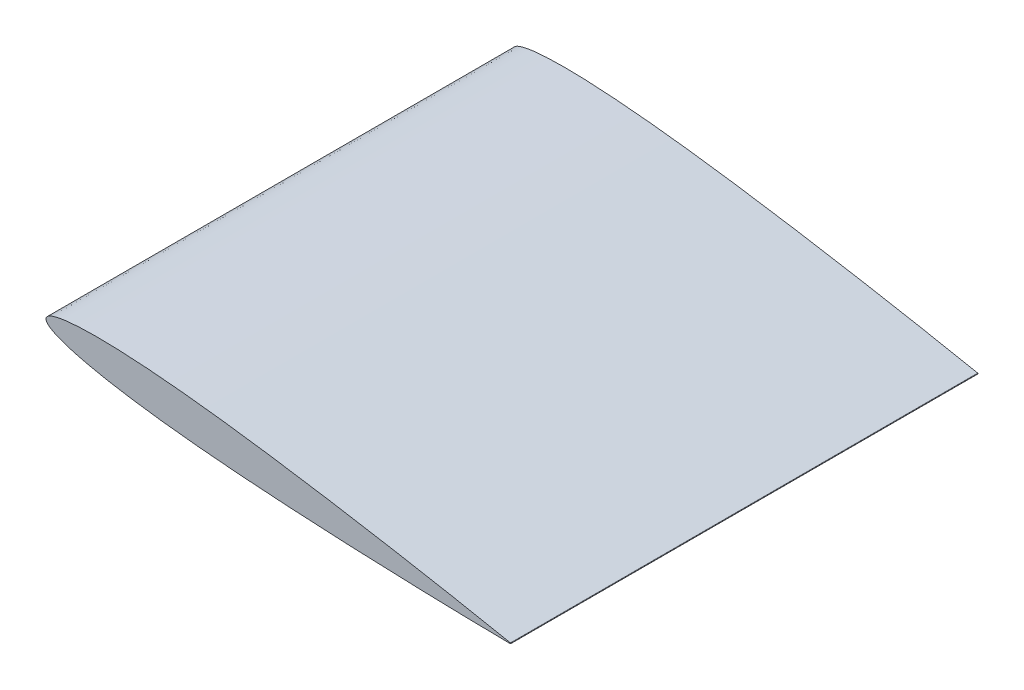
ISO-10303-21;
HEADER;
FILE_DESCRIPTION(('STEP AP214'),'2;1');
FILE_NAME('part.step','',(''),(''),'','','');
FILE_SCHEMA(('AUTOMOTIVE_DESIGN { 1 0 10303 214 1 1 1 1 }'));
ENDSEC;
DATA;
#1=APPLICATION_CONTEXT('core data for automotive mechanical design processes');
#2=APPLICATION_PROTOCOL_DEFINITION('international standard','automotive_design',2000,#1);
#3=PRODUCT_CONTEXT('',#1,'mechanical');
#4=PRODUCT('Part','Part','',(#3));
#5=PRODUCT_RELATED_PRODUCT_CATEGORY('part','',(#4));
#6=PRODUCT_DEFINITION_FORMATION('','',#4);
#7=PRODUCT_DEFINITION_CONTEXT('part definition',#1,'design');
#8=PRODUCT_DEFINITION('design','',#6,#7);
#9=PRODUCT_DEFINITION_SHAPE('','',#8);
#10=(LENGTH_UNIT() NAMED_UNIT(*) SI_UNIT(.MILLI.,.METRE.));
#11=(NAMED_UNIT(*) PLANE_ANGLE_UNIT() SI_UNIT($,.RADIAN.));
#12=(NAMED_UNIT(*) SI_UNIT($,.STERADIAN.) SOLID_ANGLE_UNIT());
#13=UNCERTAINTY_MEASURE_WITH_UNIT(LENGTH_MEASURE(1.E-05),#10,'distance_accuracy_value','');
#14=(GEOMETRIC_REPRESENTATION_CONTEXT(3) GLOBAL_UNCERTAINTY_ASSIGNED_CONTEXT((#13)) GLOBAL_UNIT_ASSIGNED_CONTEXT((#10,
#11,#12)) REPRESENTATION_CONTEXT('',''));
#15=CARTESIAN_POINT('',(0.,0.,0.));
#16=DIRECTION('',(0.,0.,1.));
#17=DIRECTION('',(1.,0.,0.));
#18=AXIS2_PLACEMENT_3D('',#15,#16,#17);
#19=CARTESIAN_POINT('',(141.964209086407,-14.7601864212014,-190.5));
#20=CARTESIAN_POINT('',(141.717840284449,-14.7107458264424,-190.5));
#21=CARTESIAN_POINT('',(141.333239439706,-14.633364335522,-190.5));
#22=CARTESIAN_POINT('',(140.779909053131,-14.5223195870705,-190.5));
#23=CARTESIAN_POINT('',(140.273837259706,-14.4210699585725,-190.5));
#24=CARTESIAN_POINT('',(139.676970785638,-14.3017762504471,-190.5));
#25=CARTESIAN_POINT('',(138.989766271427,-14.1647626829065,-190.5));
#26=CARTESIAN_POINT('',(138.2130443455,-14.0099092094399,-190.5));
#27=CARTESIAN_POINT('',(137.347333734475,-13.8382086760727,-190.5));
#28=CARTESIAN_POINT('',(136.393642519682,-13.6495424340441,-190.5));
#29=CARTESIAN_POINT('',(135.35298579186,-13.4437780665821,-190.5));
#30=CARTESIAN_POINT('',(134.226178354788,-13.2224250650618,-190.5));
#31=CARTESIAN_POINT('',(133.014433444252,-12.9847030663705,-190.5));
#32=CARTESIAN_POINT('',(131.718864681405,-12.7315865939058,-190.5));
#33=CARTESIAN_POINT('',(130.340741085886,-12.4633478320614,-190.5));
#34=CARTESIAN_POINT('',(128.881416542602,-12.1807578722215,-190.5));
#35=CARTESIAN_POINT('',(127.342373318464,-11.8836210068006,-190.5));
#36=CARTESIAN_POINT('',(125.724990220786,-11.5729400609925,-190.5));
#37=CARTESIAN_POINT('',(124.030919727435,-11.2493085937546,-190.5));
#38=CARTESIAN_POINT('',(122.261894133946,-10.9125597401053,-190.5));
#39=CARTESIAN_POINT('',(120.419535289086,-10.5637795998122,-190.5));
#40=CARTESIAN_POINT('',(118.505504200986,-10.2035186988897,-190.5));
#41=CARTESIAN_POINT('',(116.521915523221,-9.831646534504,-190.5));
#42=CARTESIAN_POINT('',(114.470588394895,-9.44958081466691,-190.5));
#43=CARTESIAN_POINT('',(112.353587299462,-9.05746095741273,-190.5));
#44=CARTESIAN_POINT('',(110.172988249332,-8.65567272921419,-190.5));
#45=CARTESIAN_POINT('',(107.930819738033,-8.24521313839941,-190.5));
#46=CARTESIAN_POINT('',(105.62938486056,-7.82631254503986,-190.5));
#47=CARTESIAN_POINT('',(103.270911797755,-7.39960432832829,-190.5));
#48=CARTESIAN_POINT('',(100.857548375852,-6.96614847493881,-190.5));
#49=CARTESIAN_POINT('',(98.3919145666271,-6.52583415106059,-190.5));
#50=CARTESIAN_POINT('',(95.8762883077157,-6.07971045530366,-190.5));
#51=CARTESIAN_POINT('',(93.313143727192,-5.62848399446458,-190.5));
#52=CARTESIAN_POINT('',(90.7050591751246,-5.17228513242238,-190.5));
#53=CARTESIAN_POINT('',(88.0544295805164,-4.71261295178478,-190.5));
#54=CARTESIAN_POINT('',(85.3639942224461,-4.24938799746568,-190.5));
#55=CARTESIAN_POINT('',(82.6363644744811,-3.78325236129781,-190.5));
#56=CARTESIAN_POINT('',(79.8740844336686,-3.31563379692277,-190.5));
#57=CARTESIAN_POINT('',(77.0801014305033,-2.8463639379538,-190.5));
#58=CARTESIAN_POINT('',(74.2569380944492,-2.37659481533454,-190.5));
#59=CARTESIAN_POINT('',(71.4074935528955,-1.90683913136029,-190.5));
#60=CARTESIAN_POINT('',(67.5639508123071,-1.27985312755456,-190.5));
#61=CARTESIAN_POINT('',(63.694254126966,-0.658025629812975,-190.5));
#62=CARTESIAN_POINT('',(59.8018034914009,-0.0440702285535669,-190.5));
#63=CARTESIAN_POINT('',(56.8627478051569,0.414441884042062,-190.5));
#64=CARTESIAN_POINT('',(53.9142006647246,0.867926761926778,-190.5));
#65=CARTESIAN_POINT('',(50.9592455328825,1.31624774120673,-190.5));
#66=CARTESIAN_POINT('',(48.0007512419188,1.75875657046678,-190.5));
#67=CARTESIAN_POINT('',(45.0414815701327,2.19408382921712,-190.5));
#68=CARTESIAN_POINT('',(42.0843661247459,2.62197141162646,-190.5));
#69=CARTESIAN_POINT('',(39.1322804032985,3.0418240125027,-190.5));
#70=CARTESIAN_POINT('',(36.1881091339395,3.45218620090561,-190.5));
#71=CARTESIAN_POINT('',(33.2547466279636,3.8530284652526,-190.5));
#72=CARTESIAN_POINT('',(30.3350287639927,4.24301379166332,-190.5));
#73=CARTESIAN_POINT('',(27.43185327184,4.62218230923401,-190.5));
#74=CARTESIAN_POINT('',(24.5479479306955,4.98881887043301,-190.5));
#75=CARTESIAN_POINT('',(21.6863201970008,5.34336294162963,-190.5));
#76=CARTESIAN_POINT('',(18.8494901051312,5.6839284431463,-190.5));
#77=CARTESIAN_POINT('',(16.040505055733,6.01136520283245,-190.5));
#78=CARTESIAN_POINT('',(13.2617917157488,6.3234619685337,-190.5));
#79=CARTESIAN_POINT('',(9.62648824414619,6.71723969653983,-190.5));
#80=CARTESIAN_POINT('',(6.03986310235682,7.08246264422255,-190.5));
#81=CARTESIAN_POINT('',(2.50543487516625,7.41647333272402,-190.5));
#82=CARTESIAN_POINT('',(-0.0809330737924468,7.64807927156673,-190.5));
#83=CARTESIAN_POINT('',(-2.62111691749232,7.8620567520378,-190.5));
#84=CARTESIAN_POINT('',(-5.11256937168542,8.05850336225749,-190.5));
#85=CARTESIAN_POINT('',(-7.55296433729756,8.23621473702159,-190.5));
#86=CARTESIAN_POINT('',(-9.93970419923642,8.39601394360452,-190.5));
#87=CARTESIAN_POINT('',(-12.2705857667435,8.53658055915639,-190.5));
#88=CARTESIAN_POINT('',(-14.5432784145848,8.65860387001757,-190.5));
#89=CARTESIAN_POINT('',(-16.7555217865439,8.76152106152905,-190.5));
#90=CARTESIAN_POINT('',(-18.9051493227722,8.84549821030985,-190.5));
#91=CARTESIAN_POINT('',(-21.6397854259246,8.93022974692458,-190.5));
#92=CARTESIAN_POINT('',(-24.2844911163367,8.97951286292535,-190.5));
#93=CARTESIAN_POINT('',(-26.8361708409259,8.98964539658046,-190.5));
#94=CARTESIAN_POINT('',(-28.6421412812899,8.97766380886542,-190.5));
#95=CARTESIAN_POINT('',(-30.3737599019717,8.94761009296009,-190.5));
#96=CARTESIAN_POINT('',(-32.0293172119453,8.89825515401224,-190.5));
#97=CARTESIAN_POINT('',(-33.6071151132633,8.83084771191534,-190.5));
#98=CARTESIAN_POINT('',(-35.1055819456191,8.74505150772407,-190.5));
#99=CARTESIAN_POINT('',(-36.523309442501,8.64124251580328,-190.5));
#100=CARTESIAN_POINT('',(-37.8588299623645,8.51973020524842,-190.5));
#101=CARTESIAN_POINT('',(-39.110813754892,8.3805001272392,-190.5));
#102=CARTESIAN_POINT('',(-40.2780168049369,8.22430156483013,-190.5));
#103=CARTESIAN_POINT('',(-41.3594611595277,8.05141433367991,-190.5));
#104=CARTESIAN_POINT('',(-42.3539552717994,7.86143258715219,-190.5));
#105=CARTESIAN_POINT('',(-43.2606853965123,7.65533527454726,-190.5));
#106=CARTESIAN_POINT('',(-44.0788488100922,7.4335158946402,-190.5));
#107=CARTESIAN_POINT('',(-44.8075774979609,7.19531712878671,-190.5));
#108=CARTESIAN_POINT('',(-45.4467096952308,6.94203427367345,-190.5));
#109=CARTESIAN_POINT('',(-45.9956686360767,6.67286365325742,-190.5));
#110=CARTESIAN_POINT('',(-46.4544855238625,6.38815823565103,-190.5));
#111=CARTESIAN_POINT('',(-46.8233372619453,6.08719342137089,-190.5));
#112=CARTESIAN_POINT('',(-47.1011181850916,5.76804502068038,-190.5));
#113=CARTESIAN_POINT('',(-47.286243052105,5.4294986347848,-190.5));
#114=CARTESIAN_POINT('',(-47.3737328799705,5.0734086773957,-190.5));
#115=CARTESIAN_POINT('',(-47.3625507312495,4.70689880401811,-190.5));
#116=CARTESIAN_POINT('',(-47.2522227258773,4.33715212990154,-190.5));
#117=CARTESIAN_POINT('',(-47.047230684881,3.96702214455114,-190.5));
#118=CARTESIAN_POINT('',(-46.7493785392983,3.59565235109295,-190.5));
#119=CARTESIAN_POINT('',(-46.360149479173,3.22139194698124,-190.5));
#120=CARTESIAN_POINT('',(-45.8795218530613,2.84349536503328,-190.5));
#121=CARTESIAN_POINT('',(-45.3073914200557,2.46230127023313,-190.5));
#122=CARTESIAN_POINT('',(-44.6444900909327,2.07714418484635,-190.5));
#123=CARTESIAN_POINT('',(-43.8907055088593,1.68932462312776,-190.5));
#124=CARTESIAN_POINT('',(-43.0470238389389,1.29838107072502,-190.5));
#125=CARTESIAN_POINT('',(-42.1141479071409,0.904866014814099,-190.5));
#126=CARTESIAN_POINT('',(-41.0926690326851,0.509906781712963,-190.5));
#127=CARTESIAN_POINT('',(-39.9838372507519,0.113355359691179,-190.5));
#128=CARTESIAN_POINT('',(-38.7885504970318,-0.284310338798126,-190.5));
#129=CARTESIAN_POINT('',(-37.507868841286,-0.68209771570871,-190.5));
#130=CARTESIAN_POINT('',(-36.143095720969,-1.07974315108878,-190.5));
#131=CARTESIAN_POINT('',(-34.6956017652563,-1.47663744998882,-190.5));
#132=CARTESIAN_POINT('',(-33.1666856467386,-1.87211878101538,-190.5));
#133=CARTESIAN_POINT('',(-31.5579545946718,-2.26618770737395,-190.5));
#134=CARTESIAN_POINT('',(-29.8708084264333,-2.65726836443823,-190.5));
#135=CARTESIAN_POINT('',(-28.1071756518834,-3.04620566844237,-190.5));
#136=CARTESIAN_POINT('',(-25.6096629447972,-3.56927580050979,-190.5));
#137=CARTESIAN_POINT('',(-23.0129986506314,-4.07348960221069,-190.5));
#138=CARTESIAN_POINT('',(-20.3209833273684,-4.56182099509724,-190.5));
#139=CARTESIAN_POINT('',(-18.2012303707241,-4.92869714426216,-190.5));
#140=CARTESIAN_POINT('',(-16.0162866416908,-5.29012982961838,-190.5));
#141=CARTESIAN_POINT('',(-13.7682362223615,-5.64550410006945,-190.5));
#142=CARTESIAN_POINT('',(-11.4594071686197,-5.99489822673673,-190.5));
#143=CARTESIAN_POINT('',(-9.09193472425772,-6.3371513204836,-190.5));
#144=CARTESIAN_POINT('',(-6.66824928516285,-6.67309449011916,-190.5));
#145=CARTESIAN_POINT('',(-4.19071925254277,-7.00138024923366,-190.5));
#146=CARTESIAN_POINT('',(-1.66187097815437,-7.32270053658819,-190.5));
#147=CARTESIAN_POINT('',(0.915824823846765,-7.63642785553522,-190.5));
#148=CARTESIAN_POINT('',(4.44205882676927,-8.04803420853228,-190.5));
#149=CARTESIAN_POINT('',(8.02585784043452,-8.44001933437529,-190.5));
#150=CARTESIAN_POINT('',(11.6632258130736,-8.81424715447755,-190.5));
#151=CARTESIAN_POINT('',(14.4458367943845,-9.08943498788558,-190.5));
#152=CARTESIAN_POINT('',(17.2612558932912,-9.35594415629746,-190.5));
#153=CARTESIAN_POINT('',(20.1066480960812,-9.61543027011111,-190.5));
#154=CARTESIAN_POINT('',(22.97921072668,-9.86642572417025,-190.5));
#155=CARTESIAN_POINT('',(25.8760853834131,-10.1102486268426,-190.5));
#156=CARTESIAN_POINT('',(28.7944227395627,-10.3458410262415,-190.5));
#157=CARTESIAN_POINT('',(31.7311969342069,-10.5743104764494,-190.5));
#158=CARTESIAN_POINT('',(34.6835825358579,-10.7950124735313,-190.5));
#159=CARTESIAN_POINT('',(37.6485269507866,-11.0086621994217,-190.5));
#160=CARTESIAN_POINT('',(40.6231935445033,-11.2146839688106,-190.5));
#161=CARTESIAN_POINT('',(43.6044572170185,-11.4138985653304,-190.5));
#162=CARTESIAN_POINT('',(46.5893815531248,-11.606287547042,-190.5));
#163=CARTESIAN_POINT('',(49.5750476535814,-11.7914914082915,-190.5));
#164=CARTESIAN_POINT('',(52.5584666657427,-11.9702720826892,-190.5));
#165=CARTESIAN_POINT('',(55.536697633553,-12.1426642988594,-190.5));
#166=CARTESIAN_POINT('',(58.5066965619151,-12.3081576515026,-190.5));
#167=CARTESIAN_POINT('',(62.4415290571206,-12.5207756651342,-190.5));
#168=CARTESIAN_POINT('',(66.3557537703492,-12.7209425151332,-190.5));
#169=CARTESIAN_POINT('',(70.2454789040576,-12.9106017672013,-190.5));
#170=CARTESIAN_POINT('',(73.1301917652832,-13.046382127695,-190.5));
#171=CARTESIAN_POINT('',(75.9892059232431,-13.1766598893874,-190.5));
#172=CARTESIAN_POINT('',(78.8195791076791,-13.3013308937907,-190.5));
#173=CARTESIAN_POINT('',(81.6186037026539,-13.4209948497043,-190.5));
#174=CARTESIAN_POINT('',(84.3834325554774,-13.5348714841995,-190.5));
#175=CARTESIAN_POINT('',(87.1112794648869,-13.6438256630292,-190.5));
#176=CARTESIAN_POINT('',(89.7994565412517,-13.7479398674939,-190.5));
#177=CARTESIAN_POINT('',(92.4453015229773,-13.846564231313,-190.5));
#178=CARTESIAN_POINT('',(95.0461591878292,-13.9406645331772,-190.5));
#179=CARTESIAN_POINT('',(97.5994808278507,-14.0298297115705,-190.5));
#180=CARTESIAN_POINT('',(100.102699296137,-14.1142340067193,-190.5));
#181=CARTESIAN_POINT('',(102.553367771182,-14.1944275752338,-190.5));
#182=CARTESIAN_POINT('',(104.948947221283,-14.269754784418,-190.5));
#183=CARTESIAN_POINT('',(107.287115792183,-14.3408036156533,-190.5));
#184=CARTESIAN_POINT('',(109.565562154583,-14.4077280687185,-190.5));
#185=CARTESIAN_POINT('',(111.781985897597,-14.4702723662204,-190.5));
#186=CARTESIAN_POINT('',(113.934195022038,-14.5289878258154,-190.5));
#187=CARTESIAN_POINT('',(116.020078730416,-14.5838180802628,-190.5));
#188=CARTESIAN_POINT('',(118.037588955649,-14.634468255789,-190.5));
#189=CARTESIAN_POINT('',(119.984650561994,-14.6819448188548,-190.5));
#190=CARTESIAN_POINT('',(121.859222798282,-14.7256784493466,-190.5));
#191=CARTESIAN_POINT('',(123.659566303426,-14.7658605889386,-190.5));
#192=CARTESIAN_POINT('',(125.383868144596,-14.8032146190575,-190.5));
#193=CARTESIAN_POINT('',(127.030469089938,-14.8372155240929,-190.5));
#194=CARTESIAN_POINT('',(128.597629132016,-14.8680986112157,-190.5));
#195=CARTESIAN_POINT('',(130.083790412472,-14.8965565891041,-190.5));
#196=CARTESIAN_POINT('',(131.487544237557,-14.922088460178,-190.5));
#197=CARTESIAN_POINT('',(132.807405524729,-14.9451655163918,-190.5));
#198=CARTESIAN_POINT('',(134.042076393429,-14.965788873439,-190.5));
#199=CARTESIAN_POINT('',(135.190264233645,-14.9846789529204,-190.5));
#200=CARTESIAN_POINT('',(136.250945567875,-15.0008191912805,-190.5));
#201=CARTESIAN_POINT('',(137.223008271524,-15.0155155932258,-190.5));
#202=CARTESIAN_POINT('',(138.105487302522,-15.0284266368443,-190.5));
#203=CARTESIAN_POINT('',(138.897421597825,-15.0392257286304,-190.5));
#204=CARTESIAN_POINT('',(139.598086713581,-15.0487733778364,-190.5));
#205=CARTESIAN_POINT('',(140.206705196874,-15.0567807780469,-190.5));
#206=CARTESIAN_POINT('',(140.91112844747,-15.0659111049002,-190.5));
#207=CARTESIAN_POINT('',(141.475451169777,-15.0726471842087,-190.5));
#208=CARTESIAN_POINT('',(141.867730050143,-15.0774403552898,-190.5));
#209=CARTESIAN_POINT('',(141.930624364997,-15.0782188168808,-190.5));
#210=B_SPLINE_CURVE_WITH_KNOTS('',3,(#19,#20,#21,#22,#23,#24,#25,#26,#27,#28,#29,#30,#31,#32,
#33,#34,#35,#36,#37,#38,#39,#40,#41,#42,#43,#44,#45,#46,#47,#48,#49,#50,#51,#52,#53,#54,#55,#56,
#57,#58,#59,#60,#61,#62,#63,#64,#65,#66,#67,#68,#69,#70,#71,#72,#73,#74,#75,#76,#77,#78,#79,#80,
#81,#82,#83,#84,#85,#86,#87,#88,#89,#90,#91,#92,#93,#94,#95,#96,#97,#98,#99,#100,#101,#102,#103,
#104,#105,#106,#107,#108,#109,#110,#111,#112,#113,#114,#115,#116,#117,#118,#119,#120,#121,#122,
#123,#124,#125,#126,#127,#128,#129,#130,#131,#132,#133,#134,#135,#136,#137,#138,#139,#140,#141,
#142,#143,#144,#145,#146,#147,#148,#149,#150,#151,#152,#153,#154,#155,#156,#157,#158,#159,#160,
#161,#162,#163,#164,#165,#166,#167,#168,#169,#170,#171,#172,#173,#174,#175,#176,#177,#178,#179,
#180,#181,#182,#183,#184,#185,#186,#187,#188,#189,#190,#191,#192,#193,#194,#195,#196,#197,#198,
#199,#200,#201,#202,#203,#204,#205,#206,#207,#208,#209),.UNSPECIFIED.,.F.,.F.,(4,1,1,1,1,1,1,1,
1,1,1,1,1,1,1,1,1,1,1,1,1,1,1,1,1,1,1,1,1,1,1,1,1,1,1,1,1,1,1,1,1,1,1,1,1,1,1,1,1,1,1,1,1,1,1,1,
1,1,1,1,1,1,1,1,1,1,1,1,1,1,1,1,1,1,1,1,1,1,1,1,1,1,1,1,1,1,1,1,1,1,1,1,1,1,1,1,1,1,1,1,1,1,1,1,
1,1,1,1,1,1,1,1,1,1,1,1,1,1,1,1,1,1,1,1,1,1,1,1,1,1,1,1,1,1,1,1,1,1,1,1,1,1,1,1,1,1,1,1,1,1,1,1,
1,1,1,1,1,1,1,1,1,1,1,1,1,1,1,1,1,1,1,1,1,1,1,1,1,1,1,1,1,1,1,1,1,1,1,1,4),(0.,
0.00196048808038713,0.00306078288954723,0.00440315115940912,0.00598710015129242,
0.00780962678363534,0.00987023823900945,0.0121663346757214,0.0146954518877861,
0.0174551251234933,0.02044271277755,0.0236548086080142,0.0270893538626305,0.0307418252005211,
0.0346086867033355,0.0386864881218547,0.0429711593175618,0.0474581806910442,0.0521426222949407,
0.0570209113106773,0.0620875440252226,0.0673380838166943,0.0727664556702497,0.0783671978029203,
0.0841358352788509,0.0900658434760326,0.0961512680582257,0.102386611537683,0.108765354390163,
0.115281579792531,0.121927783097088,0.128698472150078,0.135586708286801,0.142584959552117,
0.149687310329046,0.156886297525978,0.164174397596375,0.171545202082814,0.178990235007278,
0.186503524082293,0.19407660018027,0.209373856557355,0.217082104500233,0.224820878258927,
0.232581678728304,0.240357097895689,0.248139212500892,0.255920557432258,0.263693736348385,
0.271450841908107,0.279184433986156,0.286886142530036,0.294549552175486,0.302166304681413,
0.309729003720638,0.317230802900191,0.324663342863254,0.33202078832295,0.339294805126573,
0.346479079665125,0.360549206686105,0.367421988824451,0.374177392410363,0.380808670431015,
0.387310567301367,0.39367589404474,0.399898904621057,0.405973448559045,0.411894304865592,
0.417655822568995,0.423251855178719,0.428678293697983,0.439001415070994,0.443888497126718,
0.448586274186794,0.453091621508016,0.457400294036188,0.461508300583175,0.465412430347771,
0.469110006265822,0.472598492016245,0.475874566730092,0.478937452099033,0.481785324488124,
0.484418023324207,0.486835407607488,0.489038388494032,0.491029428368055,0.492813910030444,
0.494397940793629,0.49579342619979,0.497018051790781,0.498098706349558,0.499074547748848,0.5,
0.500925452251153,0.501901293650443,0.50298194820922,0.504206573800211,0.505602059206371,
0.507186089969557,0.508970571631945,0.510961611505969,0.513164592392513,0.515581976675793,
0.518214675511877,0.521062547900968,0.524125433269908,0.527401507983756,0.530889993734179,
0.534587569652229,0.538491699416826,0.542599705963813,0.546908378491985,0.551413725813207,
0.556111502873283,0.560998584929006,0.571321706302018,0.576748144821282,0.582344177431006,
0.588105695134409,0.594026551440956,0.600101095378944,0.606324105955261,0.612689432698634,
0.619191329568986,0.625822607589638,0.63257801117555,0.639450793313896,0.653520920334876,
0.660705194873427,0.66797921167705,0.675336657136746,0.68276919709981,0.690270996279362,
0.697833695318588,0.705450447824515,0.713113857469964,0.720815566013845,0.728549158091893,
0.736306263651616,0.744079442567742,0.751860787499109,0.759642902104311,0.767418321271696,
0.775179121741073,0.782917895499768,0.790626143442646,0.80592339981973,0.813496475917707,
0.821009764992723,0.828454797917186,0.835825602403626,0.843113702474022,0.850312689670955,
0.857415040447883,0.864413291713199,0.871301527849922,0.878072216902913,0.884718420207469,
0.891234645609837,0.897613388462318,0.903848731941775,0.909934156523968,0.91586416472115,
0.92163280219708,0.927233544329751,0.932661916183306,0.937912455974778,0.942979088689323,
0.94785737770506,0.952541819308956,0.957028840682438,0.961313511878146,0.965391313296665,
0.969258174799479,0.97291064613737,0.976345191391986,0.97955728722245,0.982544874876507,
0.985304548112214,0.987833665324279,0.990129761760991,0.992190373216365,0.994012899848708,
0.995596848840591,0.996939217110453,0.999509261835069,1.),.UNSPECIFIED.);
#211=DIRECTION('',(0.,0.,1.));
#212=VECTOR('',#211,1.);
#213=SURFACE_OF_LINEAR_EXTRUSION('',#210,#212);
#214=CARTESIAN_POINT('',(141.964209086407,-14.7601864212014,0.));
#215=CARTESIAN_POINT('',(141.717840284449,-14.7107458264424,0.));
#216=CARTESIAN_POINT('',(141.333239439706,-14.633364335522,0.));
#217=CARTESIAN_POINT('',(140.779909053131,-14.5223195870705,0.));
#218=CARTESIAN_POINT('',(140.273837259706,-14.4210699585725,0.));
#219=CARTESIAN_POINT('',(139.676970785638,-14.3017762504471,0.));
#220=CARTESIAN_POINT('',(138.989766271427,-14.1647626829065,0.));
#221=CARTESIAN_POINT('',(138.2130443455,-14.0099092094399,0.));
#222=CARTESIAN_POINT('',(137.347333734475,-13.8382086760727,0.));
#223=CARTESIAN_POINT('',(136.393642519682,-13.6495424340441,0.));
#224=CARTESIAN_POINT('',(135.35298579186,-13.4437780665821,0.));
#225=CARTESIAN_POINT('',(134.226178354788,-13.2224250650618,0.));
#226=CARTESIAN_POINT('',(133.014433444252,-12.9847030663705,0.));
#227=CARTESIAN_POINT('',(131.718864681405,-12.7315865939058,0.));
#228=CARTESIAN_POINT('',(130.340741085886,-12.4633478320614,0.));
#229=CARTESIAN_POINT('',(128.881416542602,-12.1807578722215,0.));
#230=CARTESIAN_POINT('',(127.342373318464,-11.8836210068006,0.));
#231=CARTESIAN_POINT('',(125.724990220786,-11.5729400609925,0.));
#232=CARTESIAN_POINT('',(124.030919727435,-11.2493085937546,0.));
#233=CARTESIAN_POINT('',(122.261894133946,-10.9125597401053,0.));
#234=CARTESIAN_POINT('',(120.419535289086,-10.5637795998122,0.));
#235=CARTESIAN_POINT('',(118.505504200986,-10.2035186988897,0.));
#236=CARTESIAN_POINT('',(116.521915523221,-9.831646534504,0.));
#237=CARTESIAN_POINT('',(114.470588394895,-9.44958081466691,0.));
#238=CARTESIAN_POINT('',(112.353587299462,-9.05746095741273,0.));
#239=CARTESIAN_POINT('',(110.172988249332,-8.65567272921419,0.));
#240=CARTESIAN_POINT('',(107.930819738033,-8.24521313839941,0.));
#241=CARTESIAN_POINT('',(105.62938486056,-7.82631254503986,0.));
#242=CARTESIAN_POINT('',(103.270911797755,-7.39960432832829,0.));
#243=CARTESIAN_POINT('',(100.857548375852,-6.96614847493881,0.));
#244=CARTESIAN_POINT('',(98.3919145666271,-6.52583415106059,0.));
#245=CARTESIAN_POINT('',(95.8762883077157,-6.07971045530366,0.));
#246=CARTESIAN_POINT('',(93.313143727192,-5.62848399446458,0.));
#247=CARTESIAN_POINT('',(90.7050591751246,-5.17228513242238,0.));
#248=CARTESIAN_POINT('',(88.0544295805164,-4.71261295178478,0.));
#249=CARTESIAN_POINT('',(85.3639942224461,-4.24938799746568,0.));
#250=CARTESIAN_POINT('',(82.6363644744811,-3.78325236129781,0.));
#251=CARTESIAN_POINT('',(79.8740844336686,-3.31563379692277,0.));
#252=CARTESIAN_POINT('',(77.0801014305033,-2.8463639379538,0.));
#253=CARTESIAN_POINT('',(74.2569380944492,-2.37659481533454,0.));
#254=CARTESIAN_POINT('',(71.4074935528955,-1.90683913136029,0.));
#255=CARTESIAN_POINT('',(67.5639508123071,-1.27985312755456,0.));
#256=CARTESIAN_POINT('',(63.694254126966,-0.658025629812975,0.));
#257=CARTESIAN_POINT('',(59.8018034914009,-0.0440702285535669,0.));
#258=CARTESIAN_POINT('',(56.8627478051569,0.414441884042062,0.));
#259=CARTESIAN_POINT('',(53.9142006647246,0.867926761926778,0.));
#260=CARTESIAN_POINT('',(50.9592455328825,1.31624774120673,0.));
#261=CARTESIAN_POINT('',(48.0007512419188,1.75875657046678,0.));
#262=CARTESIAN_POINT('',(45.0414815701327,2.19408382921712,0.));
#263=CARTESIAN_POINT('',(42.0843661247459,2.62197141162646,0.));
#264=CARTESIAN_POINT('',(39.1322804032985,3.0418240125027,0.));
#265=CARTESIAN_POINT('',(36.1881091339395,3.45218620090561,0.));
#266=CARTESIAN_POINT('',(33.2547466279636,3.8530284652526,0.));
#267=CARTESIAN_POINT('',(30.3350287639927,4.24301379166332,0.));
#268=CARTESIAN_POINT('',(27.43185327184,4.62218230923401,0.));
#269=CARTESIAN_POINT('',(24.5479479306955,4.98881887043301,0.));
#270=CARTESIAN_POINT('',(21.6863201970008,5.34336294162963,0.));
#271=CARTESIAN_POINT('',(18.8494901051312,5.6839284431463,0.));
#272=CARTESIAN_POINT('',(16.040505055733,6.01136520283245,0.));
#273=CARTESIAN_POINT('',(13.2617917157488,6.3234619685337,0.));
#274=CARTESIAN_POINT('',(9.62648824414619,6.71723969653983,0.));
#275=CARTESIAN_POINT('',(6.03986310235682,7.08246264422255,0.));
#276=CARTESIAN_POINT('',(2.50543487516625,7.41647333272402,0.));
#277=CARTESIAN_POINT('',(-0.0809330737924468,7.64807927156673,0.));
#278=CARTESIAN_POINT('',(-2.62111691749232,7.8620567520378,0.));
#279=CARTESIAN_POINT('',(-5.11256937168542,8.05850336225749,0.));
#280=CARTESIAN_POINT('',(-7.55296433729756,8.23621473702159,0.));
#281=CARTESIAN_POINT('',(-9.93970419923642,8.39601394360452,0.));
#282=CARTESIAN_POINT('',(-12.2705857667435,8.53658055915639,0.));
#283=CARTESIAN_POINT('',(-14.5432784145848,8.65860387001757,0.));
#284=CARTESIAN_POINT('',(-16.7555217865439,8.76152106152905,0.));
#285=CARTESIAN_POINT('',(-18.9051493227722,8.84549821030985,0.));
#286=CARTESIAN_POINT('',(-21.6397854259246,8.93022974692458,0.));
#287=CARTESIAN_POINT('',(-24.2844911163367,8.97951286292535,0.));
#288=CARTESIAN_POINT('',(-26.8361708409259,8.98964539658046,0.));
#289=CARTESIAN_POINT('',(-28.6421412812899,8.97766380886542,0.));
#290=CARTESIAN_POINT('',(-30.3737599019717,8.94761009296009,0.));
#291=CARTESIAN_POINT('',(-32.0293172119453,8.89825515401224,0.));
#292=CARTESIAN_POINT('',(-33.6071151132633,8.83084771191534,0.));
#293=CARTESIAN_POINT('',(-35.1055819456191,8.74505150772407,0.));
#294=CARTESIAN_POINT('',(-36.523309442501,8.64124251580328,0.));
#295=CARTESIAN_POINT('',(-37.8588299623645,8.51973020524842,0.));
#296=CARTESIAN_POINT('',(-39.110813754892,8.3805001272392,0.));
#297=CARTESIAN_POINT('',(-40.2780168049369,8.22430156483013,0.));
#298=CARTESIAN_POINT('',(-41.3594611595277,8.05141433367991,0.));
#299=CARTESIAN_POINT('',(-42.3539552717994,7.86143258715219,0.));
#300=CARTESIAN_POINT('',(-43.2606853965123,7.65533527454726,0.));
#301=CARTESIAN_POINT('',(-44.0788488100922,7.4335158946402,0.));
#302=CARTESIAN_POINT('',(-44.8075774979609,7.19531712878671,0.));
#303=CARTESIAN_POINT('',(-45.4467096952308,6.94203427367345,0.));
#304=CARTESIAN_POINT('',(-45.9956686360767,6.67286365325742,0.));
#305=CARTESIAN_POINT('',(-46.4544855238625,6.38815823565103,0.));
#306=CARTESIAN_POINT('',(-46.8233372619453,6.08719342137089,0.));
#307=CARTESIAN_POINT('',(-47.1011181850916,5.76804502068038,0.));
#308=CARTESIAN_POINT('',(-47.286243052105,5.4294986347848,0.));
#309=CARTESIAN_POINT('',(-47.3737328799705,5.0734086773957,0.));
#310=CARTESIAN_POINT('',(-47.3625507312495,4.70689880401811,0.));
#311=CARTESIAN_POINT('',(-47.2522227258773,4.33715212990154,0.));
#312=CARTESIAN_POINT('',(-47.047230684881,3.96702214455114,0.));
#313=CARTESIAN_POINT('',(-46.7493785392983,3.59565235109295,0.));
#314=CARTESIAN_POINT('',(-46.360149479173,3.22139194698124,0.));
#315=CARTESIAN_POINT('',(-45.8795218530613,2.84349536503328,0.));
#316=CARTESIAN_POINT('',(-45.3073914200557,2.46230127023313,0.));
#317=CARTESIAN_POINT('',(-44.6444900909327,2.07714418484635,0.));
#318=CARTESIAN_POINT('',(-43.8907055088593,1.68932462312776,0.));
#319=CARTESIAN_POINT('',(-43.0470238389389,1.29838107072502,0.));
#320=CARTESIAN_POINT('',(-42.1141479071409,0.904866014814099,0.));
#321=CARTESIAN_POINT('',(-41.0926690326851,0.509906781712963,0.));
#322=CARTESIAN_POINT('',(-39.9838372507519,0.113355359691179,0.));
#323=CARTESIAN_POINT('',(-38.7885504970318,-0.284310338798126,0.));
#324=CARTESIAN_POINT('',(-37.507868841286,-0.68209771570871,0.));
#325=CARTESIAN_POINT('',(-36.143095720969,-1.07974315108878,0.));
#326=CARTESIAN_POINT('',(-34.6956017652563,-1.47663744998882,0.));
#327=CARTESIAN_POINT('',(-33.1666856467386,-1.87211878101538,0.));
#328=CARTESIAN_POINT('',(-31.5579545946718,-2.26618770737395,0.));
#329=CARTESIAN_POINT('',(-29.8708084264333,-2.65726836443823,0.));
#330=CARTESIAN_POINT('',(-28.1071756518834,-3.04620566844237,0.));
#331=CARTESIAN_POINT('',(-25.6096629447972,-3.56927580050979,0.));
#332=CARTESIAN_POINT('',(-23.0129986506314,-4.07348960221069,0.));
#333=CARTESIAN_POINT('',(-20.3209833273684,-4.56182099509724,0.));
#334=CARTESIAN_POINT('',(-18.2012303707241,-4.92869714426216,0.));
#335=CARTESIAN_POINT('',(-16.0162866416908,-5.29012982961838,0.));
#336=CARTESIAN_POINT('',(-13.7682362223615,-5.64550410006945,0.));
#337=CARTESIAN_POINT('',(-11.4594071686197,-5.99489822673673,0.));
#338=CARTESIAN_POINT('',(-9.09193472425772,-6.3371513204836,0.));
#339=CARTESIAN_POINT('',(-6.66824928516285,-6.67309449011916,0.));
#340=CARTESIAN_POINT('',(-4.19071925254277,-7.00138024923366,0.));
#341=CARTESIAN_POINT('',(-1.66187097815437,-7.32270053658819,0.));
#342=CARTESIAN_POINT('',(0.915824823846765,-7.63642785553522,0.));
#343=CARTESIAN_POINT('',(4.44205882676927,-8.04803420853228,0.));
#344=CARTESIAN_POINT('',(8.02585784043452,-8.44001933437529,0.));
#345=CARTESIAN_POINT('',(11.6632258130736,-8.81424715447755,0.));
#346=CARTESIAN_POINT('',(14.4458367943845,-9.08943498788558,0.));
#347=CARTESIAN_POINT('',(17.2612558932912,-9.35594415629746,0.));
#348=CARTESIAN_POINT('',(20.1066480960812,-9.61543027011111,0.));
#349=CARTESIAN_POINT('',(22.97921072668,-9.86642572417025,0.));
#350=CARTESIAN_POINT('',(25.8760853834131,-10.1102486268426,0.));
#351=CARTESIAN_POINT('',(28.7944227395627,-10.3458410262415,0.));
#352=CARTESIAN_POINT('',(31.7311969342069,-10.5743104764494,0.));
#353=CARTESIAN_POINT('',(34.6835825358579,-10.7950124735313,0.));
#354=CARTESIAN_POINT('',(37.6485269507866,-11.0086621994217,0.));
#355=CARTESIAN_POINT('',(40.6231935445033,-11.2146839688106,0.));
#356=CARTESIAN_POINT('',(43.6044572170185,-11.4138985653304,0.));
#357=CARTESIAN_POINT('',(46.5893815531248,-11.606287547042,0.));
#358=CARTESIAN_POINT('',(49.5750476535814,-11.7914914082915,0.));
#359=CARTESIAN_POINT('',(52.5584666657427,-11.9702720826892,0.));
#360=CARTESIAN_POINT('',(55.536697633553,-12.1426642988594,0.));
#361=CARTESIAN_POINT('',(58.5066965619151,-12.3081576515026,0.));
#362=CARTESIAN_POINT('',(62.4415290571206,-12.5207756651342,0.));
#363=CARTESIAN_POINT('',(66.3557537703492,-12.7209425151332,0.));
#364=CARTESIAN_POINT('',(70.2454789040576,-12.9106017672013,0.));
#365=CARTESIAN_POINT('',(73.1301917652832,-13.046382127695,0.));
#366=CARTESIAN_POINT('',(75.9892059232431,-13.1766598893874,0.));
#367=CARTESIAN_POINT('',(78.8195791076791,-13.3013308937907,0.));
#368=CARTESIAN_POINT('',(81.6186037026539,-13.4209948497043,0.));
#369=CARTESIAN_POINT('',(84.3834325554774,-13.5348714841995,0.));
#370=CARTESIAN_POINT('',(87.1112794648869,-13.6438256630292,0.));
#371=CARTESIAN_POINT('',(89.7994565412517,-13.7479398674939,0.));
#372=CARTESIAN_POINT('',(92.4453015229773,-13.846564231313,0.));
#373=CARTESIAN_POINT('',(95.0461591878292,-13.9406645331772,0.));
#374=CARTESIAN_POINT('',(97.5994808278507,-14.0298297115705,0.));
#375=CARTESIAN_POINT('',(100.102699296137,-14.1142340067193,0.));
#376=CARTESIAN_POINT('',(102.553367771182,-14.1944275752338,0.));
#377=CARTESIAN_POINT('',(104.948947221283,-14.269754784418,0.));
#378=CARTESIAN_POINT('',(107.287115792183,-14.3408036156533,0.));
#379=CARTESIAN_POINT('',(109.565562154583,-14.4077280687185,0.));
#380=CARTESIAN_POINT('',(111.781985897597,-14.4702723662204,0.));
#381=CARTESIAN_POINT('',(113.934195022038,-14.5289878258154,0.));
#382=CARTESIAN_POINT('',(116.020078730416,-14.5838180802628,0.));
#383=CARTESIAN_POINT('',(118.037588955649,-14.634468255789,0.));
#384=CARTESIAN_POINT('',(119.984650561994,-14.6819448188548,0.));
#385=CARTESIAN_POINT('',(121.859222798282,-14.7256784493466,0.));
#386=CARTESIAN_POINT('',(123.659566303426,-14.7658605889386,0.));
#387=CARTESIAN_POINT('',(125.383868144596,-14.8032146190575,0.));
#388=CARTESIAN_POINT('',(127.030469089938,-14.8372155240929,0.));
#389=CARTESIAN_POINT('',(128.597629132016,-14.8680986112157,0.));
#390=CARTESIAN_POINT('',(130.083790412472,-14.8965565891041,0.));
#391=CARTESIAN_POINT('',(131.487544237557,-14.922088460178,0.));
#392=CARTESIAN_POINT('',(132.807405524729,-14.9451655163918,0.));
#393=CARTESIAN_POINT('',(134.042076393429,-14.965788873439,0.));
#394=CARTESIAN_POINT('',(135.190264233645,-14.9846789529204,0.));
#395=CARTESIAN_POINT('',(136.250945567875,-15.0008191912805,0.));
#396=CARTESIAN_POINT('',(137.223008271524,-15.0155155932258,0.));
#397=CARTESIAN_POINT('',(138.105487302522,-15.0284266368443,0.));
#398=CARTESIAN_POINT('',(138.897421597825,-15.0392257286304,0.));
#399=CARTESIAN_POINT('',(139.598086713581,-15.0487733778364,0.));
#400=CARTESIAN_POINT('',(140.206705196874,-15.0567807780469,0.));
#401=CARTESIAN_POINT('',(140.91112844747,-15.0659111049002,0.));
#402=CARTESIAN_POINT('',(141.475451169777,-15.0726471842087,0.));
#403=CARTESIAN_POINT('',(141.867730050143,-15.0774403552898,0.));
#404=CARTESIAN_POINT('',(141.930624364997,-15.0782188168808,0.));
#405=B_SPLINE_CURVE_WITH_KNOTS('',3,(#214,#215,#216,#217,#218,#219,#220,#221,#222,#223,#224,
#225,#226,#227,#228,#229,#230,#231,#232,#233,#234,#235,#236,#237,#238,#239,#240,#241,#242,#243,
#244,#245,#246,#247,#248,#249,#250,#251,#252,#253,#254,#255,#256,#257,#258,#259,#260,#261,#262,
#263,#264,#265,#266,#267,#268,#269,#270,#271,#272,#273,#274,#275,#276,#277,#278,#279,#280,#281,
#282,#283,#284,#285,#286,#287,#288,#289,#290,#291,#292,#293,#294,#295,#296,#297,#298,#299,#300,
#301,#302,#303,#304,#305,#306,#307,#308,#309,#310,#311,#312,#313,#314,#315,#316,#317,#318,#319,
#320,#321,#322,#323,#324,#325,#326,#327,#328,#329,#330,#331,#332,#333,#334,#335,#336,#337,#338,
#339,#340,#341,#342,#343,#344,#345,#346,#347,#348,#349,#350,#351,#352,#353,#354,#355,#356,#357,
#358,#359,#360,#361,#362,#363,#364,#365,#366,#367,#368,#369,#370,#371,#372,#373,#374,#375,#376,
#377,#378,#379,#380,#381,#382,#383,#384,#385,#386,#387,#388,#389,#390,#391,#392,#393,#394,#395,
#396,#397,#398,#399,#400,#401,#402,#403,#404),.UNSPECIFIED.,.F.,.F.,(4,1,1,1,1,1,1,1,1,1,1,1,1,
1,1,1,1,1,1,1,1,1,1,1,1,1,1,1,1,1,1,1,1,1,1,1,1,1,1,1,1,1,1,1,1,1,1,1,1,1,1,1,1,1,1,1,1,1,1,1,1,
1,1,1,1,1,1,1,1,1,1,1,1,1,1,1,1,1,1,1,1,1,1,1,1,1,1,1,1,1,1,1,1,1,1,1,1,1,1,1,1,1,1,1,1,1,1,1,1,
1,1,1,1,1,1,1,1,1,1,1,1,1,1,1,1,1,1,1,1,1,1,1,1,1,1,1,1,1,1,1,1,1,1,1,1,1,1,1,1,1,1,1,1,1,1,1,1,
1,1,1,1,1,1,1,1,1,1,1,1,1,1,1,1,1,1,1,1,1,1,1,1,1,1,1,1,1,1,1,4),(0.,0.00196048808038713,
0.00306078288954723,0.00440315115940912,0.00598710015129242,0.00780962678363534,
0.00987023823900945,0.0121663346757214,0.0146954518877861,0.0174551251234933,0.02044271277755,
0.0236548086080142,0.0270893538626305,0.0307418252005211,0.0346086867033355,0.0386864881218547,
0.0429711593175618,0.0474581806910442,0.0521426222949407,0.0570209113106773,0.0620875440252226,
0.0673380838166943,0.0727664556702497,0.0783671978029203,0.0841358352788509,0.0900658434760326,
0.0961512680582257,0.102386611537683,0.108765354390163,0.115281579792531,0.121927783097088,
0.128698472150078,0.135586708286801,0.142584959552117,0.149687310329046,0.156886297525978,
0.164174397596375,0.171545202082814,0.178990235007278,0.186503524082293,0.19407660018027,
0.209373856557355,0.217082104500233,0.224820878258927,0.232581678728304,0.240357097895689,
0.248139212500892,0.255920557432258,0.263693736348385,0.271450841908107,0.279184433986156,
0.286886142530036,0.294549552175486,0.302166304681413,0.309729003720638,0.317230802900191,
0.324663342863254,0.33202078832295,0.339294805126573,0.346479079665125,0.360549206686105,
0.367421988824451,0.374177392410363,0.380808670431015,0.387310567301367,0.39367589404474,
0.399898904621057,0.405973448559045,0.411894304865592,0.417655822568995,0.423251855178719,
0.428678293697983,0.439001415070994,0.443888497126718,0.448586274186794,0.453091621508016,
0.457400294036188,0.461508300583175,0.465412430347771,0.469110006265822,0.472598492016245,
0.475874566730092,0.478937452099033,0.481785324488124,0.484418023324207,0.486835407607488,
0.489038388494032,0.491029428368055,0.492813910030444,0.494397940793629,0.49579342619979,
0.497018051790781,0.498098706349558,0.499074547748848,0.5,0.500925452251153,0.501901293650443,
0.50298194820922,0.504206573800211,0.505602059206371,0.507186089969557,0.508970571631945,
0.510961611505969,0.513164592392513,0.515581976675793,0.518214675511877,0.521062547900968,
0.524125433269908,0.527401507983756,0.530889993734179,0.534587569652229,0.538491699416826,
0.542599705963813,0.546908378491985,0.551413725813207,0.556111502873283,0.560998584929006,
0.571321706302018,0.576748144821282,0.582344177431006,0.588105695134409,0.594026551440956,
0.600101095378944,0.606324105955261,0.612689432698634,0.619191329568986,0.625822607589638,
0.63257801117555,0.639450793313896,0.653520920334876,0.660705194873427,0.66797921167705,
0.675336657136746,0.68276919709981,0.690270996279362,0.697833695318588,0.705450447824515,
0.713113857469964,0.720815566013845,0.728549158091893,0.736306263651616,0.744079442567742,
0.751860787499109,0.759642902104311,0.767418321271696,0.775179121741073,0.782917895499768,
0.790626143442646,0.80592339981973,0.813496475917707,0.821009764992723,0.828454797917186,
0.835825602403626,0.843113702474022,0.850312689670955,0.857415040447883,0.864413291713199,
0.871301527849922,0.878072216902913,0.884718420207469,0.891234645609837,0.897613388462318,
0.903848731941775,0.909934156523968,0.91586416472115,0.92163280219708,0.927233544329751,
0.932661916183306,0.937912455974778,0.942979088689323,0.94785737770506,0.952541819308956,
0.957028840682438,0.961313511878146,0.965391313296665,0.969258174799479,0.97291064613737,
0.976345191391986,0.97955728722245,0.982544874876507,0.985304548112214,0.987833665324279,
0.990129761760991,0.992190373216365,0.994012899848708,0.995596848840591,0.996939217110453,
0.999509261835069,1.),.UNSPECIFIED.);
#406=CARTESIAN_POINT('',(141.964209086407,-14.7601864212014,0.));
#407=VERTEX_POINT('',#406);
#408=CARTESIAN_POINT('',(141.930624364997,-15.0782188168808,0.));
#409=VERTEX_POINT('',#408);
#410=EDGE_CURVE('E70',#407,#409,#405,.T.);
#411=ORIENTED_EDGE('',*,*,#410,.F.);
#412=DIRECTION('',(0.,0.,1.));
#413=VECTOR('',#412,1.);
#414=CARTESIAN_POINT('',(141.964209086407,-14.7601864212014,-190.5));
#415=LINE('',#414,#413);
#416=CARTESIAN_POINT('',(141.964209086407,-14.7601864212014,-190.5));
#417=VERTEX_POINT('',#416);
#418=EDGE_CURVE('E11',#417,#407,#415,.T.);
#419=ORIENTED_EDGE('',*,*,#418,.F.);
#420=CARTESIAN_POINT('',(141.930624364997,-15.0782188168808,-190.5));
#421=VERTEX_POINT('',#420);
#422=EDGE_CURVE('E76',#417,#421,#210,.T.);
#423=ORIENTED_EDGE('',*,*,#422,.T.);
#424=DIRECTION('',(0.,0.,1.));
#425=VECTOR('',#424,1.);
#426=CARTESIAN_POINT('',(141.930624364997,-15.0782188168808,-190.5));
#427=LINE('',#426,#425);
#428=EDGE_CURVE('E43',#421,#409,#427,.T.);
#429=ORIENTED_EDGE('',*,*,#428,.T.);
#430=EDGE_LOOP('',(#411,#419,#423,#429));
#431=FACE_BOUND('',#430,.T.);
#432=ADVANCED_FACE('F39',(#431),#213,.T.);
#433=CARTESIAN_POINT('',(141.932611906463,-14.9176392068339,-190.5));
#434=DIRECTION('',(0.,0.,1.));
#435=DIRECTION('',(1.,0.,0.));
#436=AXIS2_PLACEMENT_3D('',#433,#434,#435);
#437=CYLINDRICAL_SURFACE('',#436,0.160591909770946);
#438=CARTESIAN_POINT('',(141.932611906463,-14.9176392068339,0.));
#439=DIRECTION('',(0.,0.,1.));
#440=DIRECTION('',(-1.,0.,0.));
#441=AXIS2_PLACEMENT_3D('',#438,#439,#440);
#442=CIRCLE('',#441,0.160591909770946);
#443=EDGE_CURVE('E67',#409,#407,#442,.T.);
#444=ORIENTED_EDGE('',*,*,#443,.F.);
#445=ORIENTED_EDGE('',*,*,#428,.F.);
#446=CARTESIAN_POINT('',(141.932611906463,-14.9176392068339,-190.5));
#447=DIRECTION('',(0.,0.,1.));
#448=DIRECTION('',(-1.,0.,0.));
#449=AXIS2_PLACEMENT_3D('',#446,#447,#448);
#450=CIRCLE('',#449,0.160591909770946);
#451=EDGE_CURVE('E69',#421,#417,#450,.T.);
#452=ORIENTED_EDGE('',*,*,#451,.T.);
#453=ORIENTED_EDGE('',*,*,#418,.T.);
#454=EDGE_LOOP('',(#444,#445,#452,#453));
#455=FACE_BOUND('',#454,.T.);
#456=ADVANCED_FACE('F65',(#455),#437,.T.);
#457=CARTESIAN_POINT('',(-47.3575807025133,5.07170298204081,-190.5));
#458=DIRECTION('',(0.,0.,1.));
#459=DIRECTION('',(1.,0.,0.));
#460=AXIS2_PLACEMENT_3D('',#457,#458,#459);
#461=PLANE('',#460);
#462=ORIENTED_EDGE('',*,*,#422,.F.);
#463=ORIENTED_EDGE('',*,*,#451,.F.);
#464=EDGE_LOOP('',(#462,#463));
#465=FACE_BOUND('',#464,.T.);
#466=ADVANCED_FACE('F94',(#465),#461,.F.);
#467=CARTESIAN_POINT('',(-47.3575807025133,5.07170298204081,0.));
#468=DIRECTION('',(0.,0.,1.));
#469=DIRECTION('',(1.,0.,0.));
#470=AXIS2_PLACEMENT_3D('',#467,#468,#469);
#471=PLANE('',#470);
#472=ORIENTED_EDGE('',*,*,#410,.T.);
#473=ORIENTED_EDGE('',*,*,#443,.T.);
#474=EDGE_LOOP('',(#472,#473));
#475=FACE_BOUND('',#474,.T.);
#476=ADVANCED_FACE('F74',(#475),#471,.T.);
#477=CLOSED_SHELL('',(#432,#456,#466,#476));
#478=MANIFOLD_SOLID_BREP('B2',#477);
#479=ADVANCED_BREP_SHAPE_REPRESENTATION('',(#18,#478),#14);
#480=SHAPE_DEFINITION_REPRESENTATION(#9,#479);
ENDSEC;
END-ISO-10303-21;
